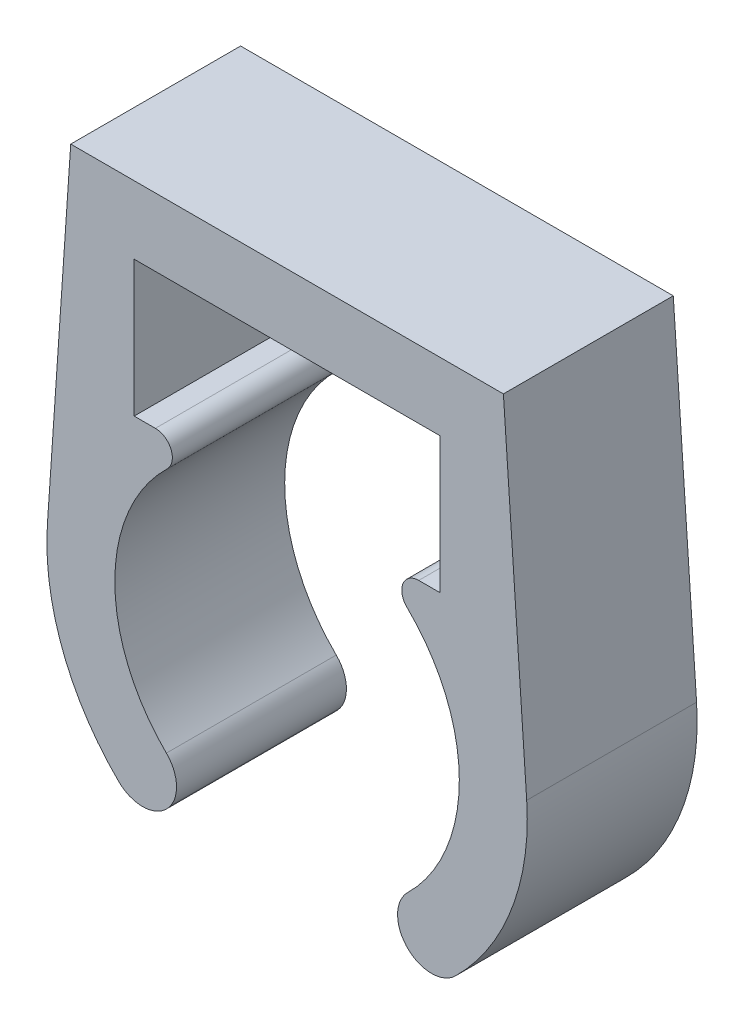
ISO-10303-21;
HEADER;
FILE_DESCRIPTION(('STEP AP214'),'2;1');
FILE_NAME('part.step','',(''),(''),'','','');
FILE_SCHEMA(('AUTOMOTIVE_DESIGN { 1 0 10303 214 1 1 1 1 }'));
ENDSEC;
DATA;
#1=APPLICATION_CONTEXT('core data for automotive mechanical design processes');
#2=APPLICATION_PROTOCOL_DEFINITION('international standard','automotive_design',2000,#1);
#3=PRODUCT_CONTEXT('',#1,'mechanical');
#4=PRODUCT('Part','Part','',(#3));
#5=PRODUCT_RELATED_PRODUCT_CATEGORY('part','',(#4));
#6=PRODUCT_DEFINITION_FORMATION('','',#4);
#7=PRODUCT_DEFINITION_CONTEXT('part definition',#1,'design');
#8=PRODUCT_DEFINITION('design','',#6,#7);
#9=PRODUCT_DEFINITION_SHAPE('','',#8);
#10=(LENGTH_UNIT() NAMED_UNIT(*) SI_UNIT(.MILLI.,.METRE.));
#11=(NAMED_UNIT(*) PLANE_ANGLE_UNIT() SI_UNIT($,.RADIAN.));
#12=(NAMED_UNIT(*) SI_UNIT($,.STERADIAN.) SOLID_ANGLE_UNIT());
#13=UNCERTAINTY_MEASURE_WITH_UNIT(LENGTH_MEASURE(1.E-05),#10,'distance_accuracy_value','');
#14=(GEOMETRIC_REPRESENTATION_CONTEXT(3) GLOBAL_UNCERTAINTY_ASSIGNED_CONTEXT((#13)) GLOBAL_UNIT_ASSIGNED_CONTEXT((#10,
#11,#12)) REPRESENTATION_CONTEXT('',''));
#15=CARTESIAN_POINT('',(0.,0.,0.));
#16=DIRECTION('',(0.,0.,1.));
#17=DIRECTION('',(1.,0.,0.));
#18=AXIS2_PLACEMENT_3D('',#15,#16,#17);
#19=CARTESIAN_POINT('',(-7.05349280277177,0.482844986767889,5.));
#20=DIRECTION('',(-0.997665177195441,0.068294906190649,0.));
#21=DIRECTION('',(-0.068294906190649,-0.997665177195441,0.));
#22=AXIS2_PLACEMENT_3D('',#19,#20,#21);
#23=PLANE('',#22);
#24=DIRECTION('',(0.068294906190649,0.997665177195441,0.));
#25=VECTOR('',#24,1.);
#26=CARTESIAN_POINT('',(-7.05349280277177,0.482844986767889,0.));
#27=LINE('',#26,#25);
#28=CARTESIAN_POINT('',(-7.05349280277177,0.482844986767887,0.));
#29=VERTEX_POINT('',#28);
#30=CARTESIAN_POINT('',(-6.36777110218177,10.5,0.));
#31=VERTEX_POINT('',#30);
#32=EDGE_CURVE('E171',#29,#31,#27,.T.);
#33=ORIENTED_EDGE('',*,*,#32,.F.);
#34=DIRECTION('',(0.,0.,-1.));
#35=VECTOR('',#34,1.);
#36=CARTESIAN_POINT('',(-7.05349280277177,0.482844986767887,5.));
#37=LINE('',#36,#35);
#38=CARTESIAN_POINT('',(-7.05349280277177,0.482844986767887,5.));
#39=VERTEX_POINT('',#38);
#40=EDGE_CURVE('E165',#39,#29,#37,.T.);
#41=ORIENTED_EDGE('',*,*,#40,.F.);
#42=DIRECTION('',(0.068294906190649,0.997665177195441,0.));
#43=VECTOR('',#42,1.);
#44=CARTESIAN_POINT('',(-7.05349280277177,0.482844986767889,5.));
#45=LINE('',#44,#43);
#46=CARTESIAN_POINT('',(-6.36777110218177,10.5,5.));
#47=VERTEX_POINT('',#46);
#48=EDGE_CURVE('E168',#39,#47,#45,.T.);
#49=ORIENTED_EDGE('',*,*,#48,.T.);
#50=DIRECTION('',(0.,0.,-1.));
#51=VECTOR('',#50,1.);
#52=CARTESIAN_POINT('',(-6.36777110218177,10.5,5.));
#53=LINE('',#52,#51);
#54=EDGE_CURVE('E215',#47,#31,#53,.T.);
#55=ORIENTED_EDGE('',*,*,#54,.T.);
#56=EDGE_LOOP('',(#33,#41,#49,#55));
#57=FACE_BOUND('',#56,.T.);
#58=ADVANCED_FACE('F41',(#57),#23,.T.);
#59=CARTESIAN_POINT('',(0.,0.,5.));
#60=DIRECTION('',(0.,0.,-1.));
#61=DIRECTION('',(-1.,0.,0.));
#62=AXIS2_PLACEMENT_3D('',#59,#60,#61);
#63=CYLINDRICAL_SURFACE('',#62,7.07);
#64=CARTESIAN_POINT('',(0.,0.,0.));
#65=DIRECTION('',(0.,0.,1.));
#66=DIRECTION('',(1.,0.,0.));
#67=AXIS2_PLACEMENT_3D('',#64,#65,#66);
#68=CIRCLE('',#67,7.07);
#69=CARTESIAN_POINT('',(-4.95387933053955,-5.04420257111597,0.));
#70=VERTEX_POINT('',#69);
#71=EDGE_CURVE('E217',#29,#70,#68,.T.);
#72=ORIENTED_EDGE('',*,*,#71,.T.);
#73=DIRECTION('',(0.,0.,-1.));
#74=VECTOR('',#73,1.);
#75=CARTESIAN_POINT('',(-4.95387933053955,-5.04420257111597,5.));
#76=LINE('',#75,#74);
#77=CARTESIAN_POINT('',(-4.95387933053955,-5.04420257111597,5.));
#78=VERTEX_POINT('',#77);
#79=EDGE_CURVE('E183',#70,#78,#76,.F.);
#80=ORIENTED_EDGE('',*,*,#79,.T.);
#81=CARTESIAN_POINT('',(0.,0.,5.));
#82=DIRECTION('',(0.,0.,1.));
#83=DIRECTION('',(1.,0.,0.));
#84=AXIS2_PLACEMENT_3D('',#81,#82,#83);
#85=CIRCLE('',#84,7.07);
#86=EDGE_CURVE('E180',#39,#78,#85,.T.);
#87=ORIENTED_EDGE('',*,*,#86,.F.);
#88=ORIENTED_EDGE('',*,*,#40,.T.);
#89=EDGE_LOOP('',(#72,#80,#87,#88));
#90=FACE_BOUND('',#89,.T.);
#91=ADVANCED_FACE('F181',(#90),#63,.T.);
#92=CARTESIAN_POINT('',(0.,0.,5.));
#93=DIRECTION('',(0.,0.,-1.));
#94=DIRECTION('',(-1.,0.,0.));
#95=AXIS2_PLACEMENT_3D('',#92,#93,#94);
#96=CYLINDRICAL_SURFACE('',#95,5.07);
#97=CARTESIAN_POINT('',(0.,0.,0.));
#98=DIRECTION('',(0.,0.,1.));
#99=DIRECTION('',(1.,0.,0.));
#100=AXIS2_PLACEMENT_3D('',#97,#98,#99);
#101=CIRCLE('',#100,5.07);
#102=CARTESIAN_POINT('',(-3.52824357423156,3.64093357271095,0.));
#103=VERTEX_POINT('',#102);
#104=CARTESIAN_POINT('',(-3.55249903901493,-3.61727115071541,0.));
#105=VERTEX_POINT('',#104);
#106=EDGE_CURVE('E220',#103,#105,#101,.T.);
#107=ORIENTED_EDGE('',*,*,#106,.F.);
#108=DIRECTION('',(0.,0.,-1.));
#109=VECTOR('',#108,1.);
#110=CARTESIAN_POINT('',(-3.52824357423156,3.64093357271095,5.));
#111=LINE('',#110,#109);
#112=CARTESIAN_POINT('',(-3.52824357423156,3.64093357271095,5.));
#113=VERTEX_POINT('',#112);
#114=EDGE_CURVE('E11',#103,#113,#111,.F.);
#115=ORIENTED_EDGE('',*,*,#114,.T.);
#116=CARTESIAN_POINT('',(0.,0.,5.));
#117=DIRECTION('',(0.,0.,1.));
#118=DIRECTION('',(1.,0.,0.));
#119=AXIS2_PLACEMENT_3D('',#116,#117,#118);
#120=CIRCLE('',#119,5.07);
#121=CARTESIAN_POINT('',(-3.55249903901493,-3.61727115071541,5.));
#122=VERTEX_POINT('',#121);
#123=EDGE_CURVE('E184',#113,#122,#120,.T.);
#124=ORIENTED_EDGE('',*,*,#123,.T.);
#125=DIRECTION('',(0.,0.,-1.));
#126=VECTOR('',#125,1.);
#127=CARTESIAN_POINT('',(-3.55249903901493,-3.61727115071541,5.));
#128=LINE('',#127,#126);
#129=EDGE_CURVE('E274',#122,#105,#128,.T.);
#130=ORIENTED_EDGE('',*,*,#129,.T.);
#131=EDGE_LOOP('',(#107,#115,#124,#130));
#132=FACE_BOUND('',#131,.T.);
#133=ADVANCED_FACE('F341',(#132),#96,.F.);
#134=CARTESIAN_POINT('',(0.,4.5,5.));
#135=DIRECTION('',(0.,-1.,0.));
#136=DIRECTION('',(1.,0.,0.));
#137=AXIS2_PLACEMENT_3D('',#134,#135,#136);
#138=PLANE('',#137);
#139=DIRECTION('',(-1.,0.,0.));
#140=VECTOR('',#139,1.);
#141=CARTESIAN_POINT('',(0.,4.5,5.));
#142=LINE('',#141,#140);
#143=CARTESIAN_POINT('',(-3.87619658944177,4.5,5.));
#144=VERTEX_POINT('',#143);
#145=CARTESIAN_POINT('',(-4.5,4.5,5.));
#146=VERTEX_POINT('',#145);
#147=EDGE_CURVE('E199',#144,#146,#142,.T.);
#148=ORIENTED_EDGE('',*,*,#147,.F.);
#149=DIRECTION('',(0.,0.,1.));
#150=VECTOR('',#149,1.);
#151=CARTESIAN_POINT('',(-3.87619658944177,4.5,0.));
#152=LINE('',#151,#150);
#153=CARTESIAN_POINT('',(-3.87619658944177,4.5,0.));
#154=VERTEX_POINT('',#153);
#155=EDGE_CURVE('E49',#144,#154,#152,.F.);
#156=ORIENTED_EDGE('',*,*,#155,.T.);
#157=DIRECTION('',(-1.,0.,0.));
#158=VECTOR('',#157,1.);
#159=CARTESIAN_POINT('',(0.,4.5,0.));
#160=LINE('',#159,#158);
#161=CARTESIAN_POINT('',(-4.5,4.5,0.));
#162=VERTEX_POINT('',#161);
#163=EDGE_CURVE('E223',#154,#162,#160,.T.);
#164=ORIENTED_EDGE('',*,*,#163,.T.);
#165=DIRECTION('',(0.,0.,-1.));
#166=VECTOR('',#165,1.);
#167=CARTESIAN_POINT('',(-4.5,4.5,5.));
#168=LINE('',#167,#166);
#169=EDGE_CURVE('E176',#146,#162,#168,.T.);
#170=ORIENTED_EDGE('',*,*,#169,.F.);
#171=EDGE_LOOP('',(#148,#156,#164,#170));
#172=FACE_BOUND('',#171,.T.);
#173=ADVANCED_FACE('F297',(#172),#138,.F.);
#174=CARTESIAN_POINT('',(-4.5,0.,5.));
#175=DIRECTION('',(1.,0.,0.));
#176=DIRECTION('',(0.,1.,0.));
#177=AXIS2_PLACEMENT_3D('',#174,#175,#176);
#178=PLANE('',#177);
#179=DIRECTION('',(0.,-1.,0.));
#180=VECTOR('',#179,1.);
#181=CARTESIAN_POINT('',(-4.5,0.,0.));
#182=LINE('',#181,#180);
#183=CARTESIAN_POINT('',(-4.5,8.5,0.));
#184=VERTEX_POINT('',#183);
#185=EDGE_CURVE('E226',#184,#162,#182,.T.);
#186=ORIENTED_EDGE('',*,*,#185,.F.);
#187=DIRECTION('',(0.,0.,-1.));
#188=VECTOR('',#187,1.);
#189=CARTESIAN_POINT('',(-4.5,8.5,5.));
#190=LINE('',#189,#188);
#191=CARTESIAN_POINT('',(-4.5,8.5,5.));
#192=VERTEX_POINT('',#191);
#193=EDGE_CURVE('E248',#192,#184,#190,.T.);
#194=ORIENTED_EDGE('',*,*,#193,.F.);
#195=DIRECTION('',(0.,-1.,0.));
#196=VECTOR('',#195,1.);
#197=CARTESIAN_POINT('',(-4.5,0.,5.));
#198=LINE('',#197,#196);
#199=EDGE_CURVE('E202',#192,#146,#198,.T.);
#200=ORIENTED_EDGE('',*,*,#199,.T.);
#201=ORIENTED_EDGE('',*,*,#169,.T.);
#202=EDGE_LOOP('',(#186,#194,#200,#201));
#203=FACE_BOUND('',#202,.T.);
#204=ADVANCED_FACE('F307',(#203),#178,.T.);
#205=CARTESIAN_POINT('',(0.,8.5,5.));
#206=DIRECTION('',(0.,-1.,0.));
#207=DIRECTION('',(0.,0.,-1.));
#208=AXIS2_PLACEMENT_3D('',#205,#206,#207);
#209=PLANE('',#208);
#210=DIRECTION('',(-1.,0.,0.));
#211=VECTOR('',#210,1.);
#212=CARTESIAN_POINT('',(0.,8.5,0.));
#213=LINE('',#212,#211);
#214=CARTESIAN_POINT('',(4.5,8.5,0.));
#215=VERTEX_POINT('',#214);
#216=EDGE_CURVE('E230',#215,#184,#213,.T.);
#217=ORIENTED_EDGE('',*,*,#216,.F.);
#218=DIRECTION('',(0.,0.,-1.));
#219=VECTOR('',#218,1.);
#220=CARTESIAN_POINT('',(4.5,8.5,5.));
#221=LINE('',#220,#219);
#222=CARTESIAN_POINT('',(4.5,8.5,5.));
#223=VERTEX_POINT('',#222);
#224=EDGE_CURVE('E246',#223,#215,#221,.T.);
#225=ORIENTED_EDGE('',*,*,#224,.F.);
#226=DIRECTION('',(-1.,0.,0.));
#227=VECTOR('',#226,1.);
#228=CARTESIAN_POINT('',(0.,8.5,5.));
#229=LINE('',#228,#227);
#230=EDGE_CURVE('E206',#223,#192,#229,.T.);
#231=ORIENTED_EDGE('',*,*,#230,.T.);
#232=ORIENTED_EDGE('',*,*,#193,.T.);
#233=EDGE_LOOP('',(#217,#225,#231,#232));
#234=FACE_BOUND('',#233,.T.);
#235=ADVANCED_FACE('F311',(#234),#209,.T.);
#236=CARTESIAN_POINT('',(4.5,0.,5.));
#237=DIRECTION('',(1.,0.,0.));
#238=DIRECTION('',(0.,1.,0.));
#239=AXIS2_PLACEMENT_3D('',#236,#237,#238);
#240=PLANE('',#239);
#241=DIRECTION('',(0.,-1.,0.));
#242=VECTOR('',#241,1.);
#243=CARTESIAN_POINT('',(4.5,0.,0.));
#244=LINE('',#243,#242);
#245=CARTESIAN_POINT('',(4.5,4.5,0.));
#246=VERTEX_POINT('',#245);
#247=EDGE_CURVE('E233',#215,#246,#244,.T.);
#248=ORIENTED_EDGE('',*,*,#247,.T.);
#249=DIRECTION('',(0.,0.,-1.));
#250=VECTOR('',#249,1.);
#251=CARTESIAN_POINT('',(4.5,4.5,5.));
#252=LINE('',#251,#250);
#253=CARTESIAN_POINT('',(4.5,4.5,5.));
#254=VERTEX_POINT('',#253);
#255=EDGE_CURVE('E243',#254,#246,#252,.T.);
#256=ORIENTED_EDGE('',*,*,#255,.F.);
#257=DIRECTION('',(0.,-1.,0.));
#258=VECTOR('',#257,1.);
#259=CARTESIAN_POINT('',(4.5,0.,5.));
#260=LINE('',#259,#258);
#261=EDGE_CURVE('E209',#223,#254,#260,.T.);
#262=ORIENTED_EDGE('',*,*,#261,.F.);
#263=ORIENTED_EDGE('',*,*,#224,.T.);
#264=EDGE_LOOP('',(#248,#256,#262,#263));
#265=FACE_BOUND('',#264,.T.);
#266=ADVANCED_FACE('F315',(#265),#240,.F.);
#267=CARTESIAN_POINT('',(3.87619658944177,4.5,0.));
#268=VERTEX_POINT('',#267);
#269=EDGE_CURVE('E227',#246,#268,#160,.T.);
#270=ORIENTED_EDGE('',*,*,#269,.T.);
#271=DIRECTION('',(0.,0.,1.));
#272=VECTOR('',#271,1.);
#273=CARTESIAN_POINT('',(3.87619658944177,4.5,5.));
#274=LINE('',#273,#272);
#275=CARTESIAN_POINT('',(3.87619658944177,4.5,5.));
#276=VERTEX_POINT('',#275);
#277=EDGE_CURVE('E289',#268,#276,#274,.T.);
#278=ORIENTED_EDGE('',*,*,#277,.T.);
#279=EDGE_CURVE('E203',#254,#276,#142,.T.);
#280=ORIENTED_EDGE('',*,*,#279,.F.);
#281=ORIENTED_EDGE('',*,*,#255,.T.);
#282=EDGE_LOOP('',(#270,#278,#280,#281));
#283=FACE_BOUND('',#282,.T.);
#284=ADVANCED_FACE('F332',(#283),#138,.F.);
#285=CARTESIAN_POINT('',(3.55249903901493,-3.61727115071541,5.));
#286=VERTEX_POINT('',#285);
#287=CARTESIAN_POINT('',(3.52824357423156,3.64093357271095,5.));
#288=VERTEX_POINT('',#287);
#289=EDGE_CURVE('E200',#286,#288,#120,.T.);
#290=ORIENTED_EDGE('',*,*,#289,.T.);
#291=DIRECTION('',(0.,0.,-1.));
#292=VECTOR('',#291,1.);
#293=CARTESIAN_POINT('',(3.52824357423156,3.64093357271095,5.));
#294=LINE('',#293,#292);
#295=CARTESIAN_POINT('',(3.52824357423156,3.64093357271095,0.));
#296=VERTEX_POINT('',#295);
#297=EDGE_CURVE('E277',#288,#296,#294,.T.);
#298=ORIENTED_EDGE('',*,*,#297,.T.);
#299=CARTESIAN_POINT('',(3.55249903901493,-3.61727115071541,0.));
#300=VERTEX_POINT('',#299);
#301=EDGE_CURVE('E224',#300,#296,#101,.T.);
#302=ORIENTED_EDGE('',*,*,#301,.F.);
#303=DIRECTION('',(0.,0.,-1.));
#304=VECTOR('',#303,1.);
#305=CARTESIAN_POINT('',(3.55249903901493,-3.61727115071541,5.));
#306=LINE('',#305,#304);
#307=EDGE_CURVE('E271',#300,#286,#306,.F.);
#308=ORIENTED_EDGE('',*,*,#307,.T.);
#309=EDGE_LOOP('',(#290,#298,#302,#308));
#310=FACE_BOUND('',#309,.T.);
#311=ADVANCED_FACE('F327',(#310),#96,.F.);
#312=CARTESIAN_POINT('',(4.95387933053955,-5.04420257111597,5.));
#313=VERTEX_POINT('',#312);
#314=CARTESIAN_POINT('',(7.05349280277177,0.482844986767887,5.));
#315=VERTEX_POINT('',#314);
#316=EDGE_CURVE('E186',#313,#315,#85,.T.);
#317=ORIENTED_EDGE('',*,*,#316,.F.);
#318=DIRECTION('',(0.,0.,-1.));
#319=VECTOR('',#318,1.);
#320=CARTESIAN_POINT('',(4.95387933053955,-5.04420257111597,5.));
#321=LINE('',#320,#319);
#322=CARTESIAN_POINT('',(4.95387933053955,-5.04420257111597,0.));
#323=VERTEX_POINT('',#322);
#324=EDGE_CURVE('E175',#313,#323,#321,.T.);
#325=ORIENTED_EDGE('',*,*,#324,.T.);
#326=CARTESIAN_POINT('',(7.05349280277177,0.482844986767887,0.));
#327=VERTEX_POINT('',#326);
#328=EDGE_CURVE('E221',#323,#327,#68,.T.);
#329=ORIENTED_EDGE('',*,*,#328,.T.);
#330=DIRECTION('',(0.,0.,-1.));
#331=VECTOR('',#330,1.);
#332=CARTESIAN_POINT('',(7.05349280277177,0.482844986767887,5.));
#333=LINE('',#332,#331);
#334=EDGE_CURVE('E240',#315,#327,#333,.T.);
#335=ORIENTED_EDGE('',*,*,#334,.F.);
#336=EDGE_LOOP('',(#317,#325,#329,#335));
#337=FACE_BOUND('',#336,.T.);
#338=ADVANCED_FACE('F339',(#337),#63,.T.);
#339=CARTESIAN_POINT('',(7.05349280277177,0.482844986767889,5.));
#340=DIRECTION('',(0.997665177195441,0.068294906190649,0.));
#341=DIRECTION('',(-0.068294906190649,0.997665177195441,0.));
#342=AXIS2_PLACEMENT_3D('',#339,#340,#341);
#343=PLANE('',#342);
#344=DIRECTION('',(0.068294906190649,-0.997665177195441,0.));
#345=VECTOR('',#344,1.);
#346=CARTESIAN_POINT('',(7.05349280277177,0.482844986767889,0.));
#347=LINE('',#346,#345);
#348=CARTESIAN_POINT('',(6.36777110218177,10.5,0.));
#349=VERTEX_POINT('',#348);
#350=EDGE_CURVE('E195',#349,#327,#347,.T.);
#351=ORIENTED_EDGE('',*,*,#350,.F.);
#352=DIRECTION('',(0.,0.,-1.));
#353=VECTOR('',#352,1.);
#354=CARTESIAN_POINT('',(6.36777110218177,10.5,5.));
#355=LINE('',#354,#353);
#356=CARTESIAN_POINT('',(6.36777110218177,10.5,5.));
#357=VERTEX_POINT('',#356);
#358=EDGE_CURVE('E238',#357,#349,#355,.T.);
#359=ORIENTED_EDGE('',*,*,#358,.F.);
#360=DIRECTION('',(0.068294906190649,-0.997665177195441,0.));
#361=VECTOR('',#360,1.);
#362=CARTESIAN_POINT('',(7.05349280277177,0.482844986767889,5.));
#363=LINE('',#362,#361);
#364=EDGE_CURVE('E211',#357,#315,#363,.T.);
#365=ORIENTED_EDGE('',*,*,#364,.T.);
#366=ORIENTED_EDGE('',*,*,#334,.T.);
#367=EDGE_LOOP('',(#351,#359,#365,#366));
#368=FACE_BOUND('',#367,.T.);
#369=ADVANCED_FACE('F469',(#368),#343,.T.);
#370=CARTESIAN_POINT('',(0.,10.5,5.));
#371=DIRECTION('',(0.,1.,0.));
#372=DIRECTION('',(0.,0.,1.));
#373=AXIS2_PLACEMENT_3D('',#370,#371,#372);
#374=PLANE('',#373);
#375=DIRECTION('',(1.,0.,0.));
#376=VECTOR('',#375,1.);
#377=CARTESIAN_POINT('',(0.,10.5,0.));
#378=LINE('',#377,#376);
#379=EDGE_CURVE('E192',#31,#349,#378,.T.);
#380=ORIENTED_EDGE('',*,*,#379,.F.);
#381=ORIENTED_EDGE('',*,*,#54,.F.);
#382=DIRECTION('',(1.,0.,0.));
#383=VECTOR('',#382,1.);
#384=CARTESIAN_POINT('',(0.,10.5,5.));
#385=LINE('',#384,#383);
#386=EDGE_CURVE('E191',#47,#357,#385,.T.);
#387=ORIENTED_EDGE('',*,*,#386,.T.);
#388=ORIENTED_EDGE('',*,*,#358,.T.);
#389=EDGE_LOOP('',(#380,#381,#387,#388));
#390=FACE_BOUND('',#389,.T.);
#391=ADVANCED_FACE('F400',(#390),#374,.T.);
#392=CARTESIAN_POINT('',(0.,0.,5.));
#393=DIRECTION('',(0.,0.,1.));
#394=DIRECTION('',(1.,0.,0.));
#395=AXIS2_PLACEMENT_3D('',#392,#393,#394);
#396=PLANE('',#395);
#397=ORIENTED_EDGE('',*,*,#279,.T.);
#398=CARTESIAN_POINT('',(3.87619658944177,4.,5.));
#399=DIRECTION('',(0.,0.,1.));
#400=DIRECTION('',(1.,0.,0.));
#401=AXIS2_PLACEMENT_3D('',#398,#399,#400);
#402=CIRCLE('',#401,0.5);
#403=EDGE_CURVE('E292',#276,#288,#402,.T.);
#404=ORIENTED_EDGE('',*,*,#403,.T.);
#405=ORIENTED_EDGE('',*,*,#289,.F.);
#406=CARTESIAN_POINT('',(4.25318918477724,-4.33073686091569,5.));
#407=DIRECTION('',(0.,0.,1.));
#408=DIRECTION('',(1.,0.,0.));
#409=AXIS2_PLACEMENT_3D('',#406,#407,#408);
#410=CIRCLE('',#409,1.);
#411=CARTESIAN_POINT('',(3.43403714048825,-4.90431329726673,5.));
#412=VERTEX_POINT('',#411);
#413=EDGE_CURVE('E267',#286,#412,#410,.T.);
#414=ORIENTED_EDGE('',*,*,#413,.T.);
#415=CARTESIAN_POINT('',(4.25318918477724,-4.33073686091569,5.));
#416=DIRECTION('',(0.,0.,1.));
#417=DIRECTION('',(1.,0.,0.));
#418=AXIS2_PLACEMENT_3D('',#415,#416,#417);
#419=CIRCLE('',#418,1.);
#420=EDGE_CURVE('E269',#412,#313,#419,.T.);
#421=ORIENTED_EDGE('',*,*,#420,.T.);
#422=ORIENTED_EDGE('',*,*,#316,.T.);
#423=ORIENTED_EDGE('',*,*,#364,.F.);
#424=ORIENTED_EDGE('',*,*,#386,.F.);
#425=ORIENTED_EDGE('',*,*,#48,.F.);
#426=ORIENTED_EDGE('',*,*,#86,.T.);
#427=CARTESIAN_POINT('',(-4.25318918477724,-4.33073686091569,5.));
#428=DIRECTION('',(0.,0.,1.));
#429=DIRECTION('',(1.,0.,0.));
#430=AXIS2_PLACEMENT_3D('',#427,#428,#429);
#431=CIRCLE('',#430,1.);
#432=CARTESIAN_POINT('',(-3.43403714048825,-4.90431329726673,5.));
#433=VERTEX_POINT('',#432);
#434=EDGE_CURVE('E265',#78,#433,#431,.T.);
#435=ORIENTED_EDGE('',*,*,#434,.T.);
#436=CARTESIAN_POINT('',(-4.25318918477724,-4.33073686091569,5.));
#437=DIRECTION('',(0.,0.,1.));
#438=DIRECTION('',(1.,0.,0.));
#439=AXIS2_PLACEMENT_3D('',#436,#437,#438);
#440=CIRCLE('',#439,1.);
#441=EDGE_CURVE('E262',#433,#122,#440,.T.);
#442=ORIENTED_EDGE('',*,*,#441,.T.);
#443=ORIENTED_EDGE('',*,*,#123,.F.);
#444=CARTESIAN_POINT('',(-3.87619658944177,4.,5.));
#445=DIRECTION('',(0.,0.,1.));
#446=DIRECTION('',(1.,0.,0.));
#447=AXIS2_PLACEMENT_3D('',#444,#445,#446);
#448=CIRCLE('',#447,0.5);
#449=EDGE_CURVE('E56',#113,#144,#448,.T.);
#450=ORIENTED_EDGE('',*,*,#449,.T.);
#451=ORIENTED_EDGE('',*,*,#147,.T.);
#452=ORIENTED_EDGE('',*,*,#199,.F.);
#453=ORIENTED_EDGE('',*,*,#230,.F.);
#454=ORIENTED_EDGE('',*,*,#261,.T.);
#455=EDGE_LOOP('',(#397,#404,#405,#414,#421,#422,#423,#424,#425,#426,#435,#442,#443,#450,#451,
#452,#453,#454));
#456=FACE_BOUND('',#455,.T.);
#457=ADVANCED_FACE('F188',(#456),#396,.T.);
#458=CARTESIAN_POINT('',(0.,0.,0.));
#459=DIRECTION('',(0.,0.,1.));
#460=DIRECTION('',(1.,0.,0.));
#461=AXIS2_PLACEMENT_3D('',#458,#459,#460);
#462=PLANE('',#461);
#463=ORIENTED_EDGE('',*,*,#301,.T.);
#464=CARTESIAN_POINT('',(3.87619658944177,4.,0.));
#465=DIRECTION('',(0.,0.,1.));
#466=DIRECTION('',(1.,0.,0.));
#467=AXIS2_PLACEMENT_3D('',#464,#465,#466);
#468=CIRCLE('',#467,0.5);
#469=EDGE_CURVE('E287',#296,#268,#468,.F.);
#470=ORIENTED_EDGE('',*,*,#469,.T.);
#471=ORIENTED_EDGE('',*,*,#269,.F.);
#472=ORIENTED_EDGE('',*,*,#247,.F.);
#473=ORIENTED_EDGE('',*,*,#216,.T.);
#474=ORIENTED_EDGE('',*,*,#185,.T.);
#475=ORIENTED_EDGE('',*,*,#163,.F.);
#476=CARTESIAN_POINT('',(-3.87619658944177,4.,0.));
#477=DIRECTION('',(0.,0.,1.));
#478=DIRECTION('',(1.,0.,0.));
#479=AXIS2_PLACEMENT_3D('',#476,#477,#478);
#480=CIRCLE('',#479,0.5);
#481=EDGE_CURVE('E285',#154,#103,#480,.F.);
#482=ORIENTED_EDGE('',*,*,#481,.T.);
#483=ORIENTED_EDGE('',*,*,#106,.T.);
#484=CARTESIAN_POINT('',(-4.25318918477724,-4.33073686091569,0.));
#485=DIRECTION('',(0.,0.,1.));
#486=DIRECTION('',(1.,0.,0.));
#487=AXIS2_PLACEMENT_3D('',#484,#485,#486);
#488=CIRCLE('',#487,1.);
#489=CARTESIAN_POINT('',(-3.43403714048825,-4.90431329726673,0.));
#490=VERTEX_POINT('',#489);
#491=EDGE_CURVE('E254',#105,#490,#488,.F.);
#492=ORIENTED_EDGE('',*,*,#491,.T.);
#493=CARTESIAN_POINT('',(-4.25318918477724,-4.33073686091569,0.));
#494=DIRECTION('',(0.,0.,1.));
#495=DIRECTION('',(1.,0.,0.));
#496=AXIS2_PLACEMENT_3D('',#493,#494,#495);
#497=CIRCLE('',#496,1.);
#498=EDGE_CURVE('E256',#490,#70,#497,.F.);
#499=ORIENTED_EDGE('',*,*,#498,.T.);
#500=ORIENTED_EDGE('',*,*,#71,.F.);
#501=ORIENTED_EDGE('',*,*,#32,.T.);
#502=ORIENTED_EDGE('',*,*,#379,.T.);
#503=ORIENTED_EDGE('',*,*,#350,.T.);
#504=ORIENTED_EDGE('',*,*,#328,.F.);
#505=CARTESIAN_POINT('',(4.25318918477724,-4.33073686091569,0.));
#506=DIRECTION('',(0.,0.,1.));
#507=DIRECTION('',(1.,0.,0.));
#508=AXIS2_PLACEMENT_3D('',#505,#506,#507);
#509=CIRCLE('',#508,1.);
#510=CARTESIAN_POINT('',(3.43403714048825,-4.90431329726673,0.));
#511=VERTEX_POINT('',#510);
#512=EDGE_CURVE('E260',#323,#511,#509,.F.);
#513=ORIENTED_EDGE('',*,*,#512,.T.);
#514=CARTESIAN_POINT('',(4.25318918477724,-4.33073686091569,0.));
#515=DIRECTION('',(0.,0.,1.));
#516=DIRECTION('',(1.,0.,0.));
#517=AXIS2_PLACEMENT_3D('',#514,#515,#516);
#518=CIRCLE('',#517,1.);
#519=EDGE_CURVE('E258',#511,#300,#518,.F.);
#520=ORIENTED_EDGE('',*,*,#519,.T.);
#521=EDGE_LOOP('',(#463,#470,#471,#472,#473,#474,#475,#482,#483,#492,#499,#500,#501,#502,#503,
#504,#513,#520));
#522=FACE_BOUND('',#521,.T.);
#523=ADVANCED_FACE('F302',(#522),#462,.F.);
#524=CARTESIAN_POINT('',(4.25318918477724,-4.33073686091569,5.));
#525=DIRECTION('',(0.,0.,-1.));
#526=DIRECTION('',(-1.,0.,0.));
#527=AXIS2_PLACEMENT_3D('',#524,#525,#526);
#528=CYLINDRICAL_SURFACE('',#527,1.);
#529=DIRECTION('',(0.,0.,1.));
#530=VECTOR('',#529,1.);
#531=CARTESIAN_POINT('',(3.43403714048825,-4.90431329726673,0.));
#532=LINE('',#531,#530);
#533=EDGE_CURVE('E218',#412,#511,#532,.F.);
#534=ORIENTED_EDGE('',*,*,#533,.F.);
#535=ORIENTED_EDGE('',*,*,#413,.F.);
#536=ORIENTED_EDGE('',*,*,#307,.F.);
#537=ORIENTED_EDGE('',*,*,#519,.F.);
#538=EDGE_LOOP('',(#534,#535,#536,#537));
#539=FACE_BOUND('',#538,.T.);
#540=ADVANCED_FACE('F357',(#539),#528,.T.);
#541=CARTESIAN_POINT('',(4.25318918477724,-4.33073686091569,5.));
#542=DIRECTION('',(0.,0.,-1.));
#543=DIRECTION('',(-1.,0.,0.));
#544=AXIS2_PLACEMENT_3D('',#541,#542,#543);
#545=CYLINDRICAL_SURFACE('',#544,1.);
#546=ORIENTED_EDGE('',*,*,#420,.F.);
#547=ORIENTED_EDGE('',*,*,#533,.T.);
#548=ORIENTED_EDGE('',*,*,#512,.F.);
#549=ORIENTED_EDGE('',*,*,#324,.F.);
#550=EDGE_LOOP('',(#546,#547,#548,#549));
#551=FACE_BOUND('',#550,.T.);
#552=ADVANCED_FACE('F353',(#551),#545,.T.);
#553=CARTESIAN_POINT('',(-4.25318918477724,-4.33073686091569,5.));
#554=DIRECTION('',(0.,0.,-1.));
#555=DIRECTION('',(-1.,0.,0.));
#556=AXIS2_PLACEMENT_3D('',#553,#554,#555);
#557=CYLINDRICAL_SURFACE('',#556,1.);
#558=ORIENTED_EDGE('',*,*,#129,.F.);
#559=ORIENTED_EDGE('',*,*,#441,.F.);
#560=DIRECTION('',(0.,0.,-1.));
#561=VECTOR('',#560,1.);
#562=CARTESIAN_POINT('',(-3.43403714048825,-4.90431329726673,5.));
#563=LINE('',#562,#561);
#564=EDGE_CURVE('E280',#490,#433,#563,.F.);
#565=ORIENTED_EDGE('',*,*,#564,.F.);
#566=ORIENTED_EDGE('',*,*,#491,.F.);
#567=EDGE_LOOP('',(#558,#559,#565,#566));
#568=FACE_BOUND('',#567,.T.);
#569=ADVANCED_FACE('F356',(#568),#557,.T.);
#570=CARTESIAN_POINT('',(-4.25318918477724,-4.33073686091569,5.));
#571=DIRECTION('',(0.,0.,-1.));
#572=DIRECTION('',(-1.,0.,0.));
#573=AXIS2_PLACEMENT_3D('',#570,#571,#572);
#574=CYLINDRICAL_SURFACE('',#573,1.);
#575=ORIENTED_EDGE('',*,*,#434,.F.);
#576=ORIENTED_EDGE('',*,*,#79,.F.);
#577=ORIENTED_EDGE('',*,*,#498,.F.);
#578=ORIENTED_EDGE('',*,*,#564,.T.);
#579=EDGE_LOOP('',(#575,#576,#577,#578));
#580=FACE_BOUND('',#579,.T.);
#581=ADVANCED_FACE('F362',(#580),#574,.T.);
#582=CARTESIAN_POINT('',(3.87619658944177,4.,5.));
#583=DIRECTION('',(0.,0.,-1.));
#584=DIRECTION('',(-1.,0.,0.));
#585=AXIS2_PLACEMENT_3D('',#582,#583,#584);
#586=CYLINDRICAL_SURFACE('',#585,0.5);
#587=ORIENTED_EDGE('',*,*,#403,.F.);
#588=ORIENTED_EDGE('',*,*,#277,.F.);
#589=ORIENTED_EDGE('',*,*,#469,.F.);
#590=ORIENTED_EDGE('',*,*,#297,.F.);
#591=EDGE_LOOP('',(#587,#588,#589,#590));
#592=FACE_BOUND('',#591,.T.);
#593=ADVANCED_FACE('F324',(#592),#586,.T.);
#594=CARTESIAN_POINT('',(-3.87619658944177,4.,5.));
#595=DIRECTION('',(0.,0.,-1.));
#596=DIRECTION('',(-1.,0.,0.));
#597=AXIS2_PLACEMENT_3D('',#594,#595,#596);
#598=CYLINDRICAL_SURFACE('',#597,0.5);
#599=ORIENTED_EDGE('',*,*,#449,.F.);
#600=ORIENTED_EDGE('',*,*,#114,.F.);
#601=ORIENTED_EDGE('',*,*,#481,.F.);
#602=ORIENTED_EDGE('',*,*,#155,.F.);
#603=EDGE_LOOP('',(#599,#600,#601,#602));
#604=FACE_BOUND('',#603,.T.);
#605=ADVANCED_FACE('F43',(#604),#598,.T.);
#606=CLOSED_SHELL('',(#58,#91,#133,#173,#204,#235,#266,#284,#311,#338,#369,#391,#457,#523,#540,
#552,#569,#581,#593,#605));
#607=MANIFOLD_SOLID_BREP('B2',#606);
#608=ADVANCED_BREP_SHAPE_REPRESENTATION('',(#18,#607),#14);
#609=SHAPE_DEFINITION_REPRESENTATION(#9,#608);
ENDSEC;
END-ISO-10303-21;
